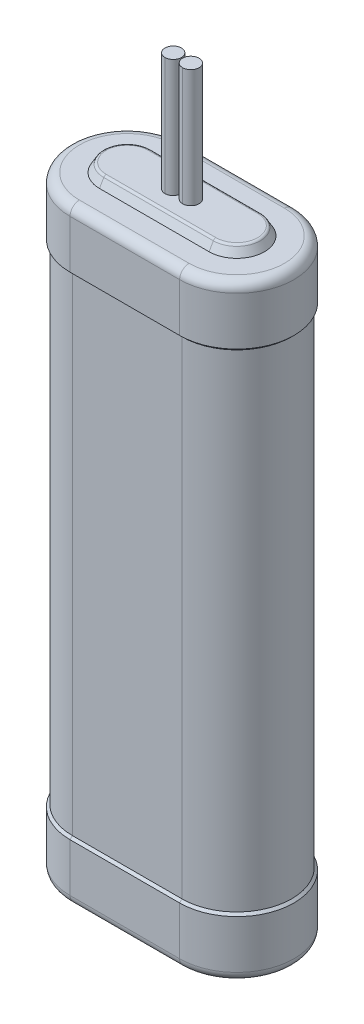
ISO-10303-21;
HEADER;
FILE_DESCRIPTION(('STEP AP214'),'2;1');
FILE_NAME('part.step','',(''),(''),'','','');
FILE_SCHEMA(('AUTOMOTIVE_DESIGN { 1 0 10303 214 1 1 1 1 }'));
ENDSEC;
DATA;
#1=APPLICATION_CONTEXT('core data for automotive mechanical design processes');
#2=APPLICATION_PROTOCOL_DEFINITION('international standard','automotive_design',2000,#1);
#3=PRODUCT_CONTEXT('',#1,'mechanical');
#4=PRODUCT('Part','Part','',(#3));
#5=PRODUCT_RELATED_PRODUCT_CATEGORY('part','',(#4));
#6=PRODUCT_DEFINITION_FORMATION('','',#4);
#7=PRODUCT_DEFINITION_CONTEXT('part definition',#1,'design');
#8=PRODUCT_DEFINITION('design','',#6,#7);
#9=PRODUCT_DEFINITION_SHAPE('','',#8);
#10=(LENGTH_UNIT() NAMED_UNIT(*) SI_UNIT(.MILLI.,.METRE.));
#11=(NAMED_UNIT(*) PLANE_ANGLE_UNIT() SI_UNIT($,.RADIAN.));
#12=(NAMED_UNIT(*) SI_UNIT($,.STERADIAN.) SOLID_ANGLE_UNIT());
#13=UNCERTAINTY_MEASURE_WITH_UNIT(LENGTH_MEASURE(1.E-05),#10,'distance_accuracy_value','');
#14=(GEOMETRIC_REPRESENTATION_CONTEXT(3) GLOBAL_UNCERTAINTY_ASSIGNED_CONTEXT((#13)) GLOBAL_UNIT_ASSIGNED_CONTEXT((#10,
#11,#12)) REPRESENTATION_CONTEXT('',''));
#15=CARTESIAN_POINT('',(0.,0.,0.));
#16=DIRECTION('',(0.,0.,1.));
#17=DIRECTION('',(1.,0.,0.));
#18=AXIS2_PLACEMENT_3D('',#15,#16,#17);
#19=CARTESIAN_POINT('',(11.811,52.451,11.811));
#20=DIRECTION('',(0.,0.707106781186548,-0.707106781186548));
#21=DIRECTION('',(-1.,0.,0.));
#22=AXIS2_PLACEMENT_3D('',#19,#20,#21);
#23=PLANE('',#22);
#24=DIRECTION('',(0.,0.707106781186548,0.707106781186548));
#25=VECTOR('',#24,1.);
#26=CARTESIAN_POINT('',(11.811,52.451,11.811));
#27=LINE('',#26,#25);
#28=CARTESIAN_POINT('',(11.811,52.451,11.811));
#29=VERTEX_POINT('',#28);
#30=CARTESIAN_POINT('',(11.811,52.959,12.319));
#31=VERTEX_POINT('',#30);
#32=EDGE_CURVE('E10',#29,#31,#27,.T.);
#33=ORIENTED_EDGE('',*,*,#32,.T.);
#34=DIRECTION('',(1.,0.,0.));
#35=VECTOR('',#34,1.);
#36=CARTESIAN_POINT('',(11.811,52.959,12.319));
#37=LINE('',#36,#35);
#38=CARTESIAN_POINT('',(-11.811,52.959,12.319));
#39=VERTEX_POINT('',#38);
#40=EDGE_CURVE('E328',#39,#31,#37,.T.);
#41=ORIENTED_EDGE('',*,*,#40,.F.);
#42=DIRECTION('',(0.,0.707106781186548,0.707106781186548));
#43=VECTOR('',#42,1.);
#44=CARTESIAN_POINT('',(-11.811,52.451,11.811));
#45=LINE('',#44,#43);
#46=CARTESIAN_POINT('',(-11.811,52.451,11.811));
#47=VERTEX_POINT('',#46);
#48=EDGE_CURVE('E343',#47,#39,#45,.T.);
#49=ORIENTED_EDGE('',*,*,#48,.F.);
#50=DIRECTION('',(1.,0.,0.));
#51=VECTOR('',#50,1.);
#52=CARTESIAN_POINT('',(-11.811,52.451,11.811));
#53=LINE('',#52,#51);
#54=EDGE_CURVE('E30',#47,#29,#53,.T.);
#55=ORIENTED_EDGE('',*,*,#54,.T.);
#56=EDGE_LOOP('',(#33,#41,#49,#55));
#57=FACE_BOUND('',#56,.T.);
#58=ADVANCED_FACE('F16',(#57),#23,.F.);
#59=CARTESIAN_POINT('',(11.811,52.451,0.));
#60=DIRECTION('',(0.,1.,0.));
#61=DIRECTION('',(0.,0.,1.));
#62=AXIS2_PLACEMENT_3D('',#59,#60,#61);
#63=CONICAL_SURFACE('',#62,11.811,0.785398163397448);
#64=DIRECTION('',(0.,-0.707106781186548,0.707106781186548));
#65=VECTOR('',#64,1.);
#66=CARTESIAN_POINT('',(11.811,52.959,-12.319));
#67=LINE('',#66,#65);
#68=CARTESIAN_POINT('',(11.811,52.959,-12.319));
#69=VERTEX_POINT('',#68);
#70=CARTESIAN_POINT('',(11.811,52.451,-11.811));
#71=VERTEX_POINT('',#70);
#72=EDGE_CURVE('E331',#69,#71,#67,.T.);
#73=ORIENTED_EDGE('',*,*,#72,.F.);
#74=CARTESIAN_POINT('',(11.811,52.959,0.));
#75=DIRECTION('',(0.,1.,0.));
#76=DIRECTION('',(0.,0.,1.));
#77=AXIS2_PLACEMENT_3D('',#74,#75,#76);
#78=CIRCLE('',#77,12.319);
#79=EDGE_CURVE('E45',#31,#69,#78,.T.);
#80=ORIENTED_EDGE('',*,*,#79,.F.);
#81=ORIENTED_EDGE('',*,*,#32,.F.);
#82=CARTESIAN_POINT('',(11.811,52.451,0.));
#83=DIRECTION('',(0.,1.,0.));
#84=DIRECTION('',(0.,0.,1.));
#85=AXIS2_PLACEMENT_3D('',#82,#83,#84);
#86=CIRCLE('',#85,11.811);
#87=EDGE_CURVE('E335',#29,#71,#86,.T.);
#88=ORIENTED_EDGE('',*,*,#87,.T.);
#89=EDGE_LOOP('',(#73,#80,#81,#88));
#90=FACE_BOUND('',#89,.T.);
#91=ADVANCED_FACE('F579',(#90),#63,.T.);
#92=CARTESIAN_POINT('',(11.811,52.451,12.319));
#93=DIRECTION('',(0.,0.,-1.));
#94=DIRECTION('',(0.,-1.,0.));
#95=AXIS2_PLACEMENT_3D('',#92,#93,#94);
#96=PLANE('',#95);
#97=DIRECTION('',(0.,1.,0.));
#98=VECTOR('',#97,1.);
#99=CARTESIAN_POINT('',(-11.811,52.451,12.319));
#100=LINE('',#99,#98);
#101=CARTESIAN_POINT('',(-11.811,63.373,12.319));
#102=VERTEX_POINT('',#101);
#103=EDGE_CURVE('E280',#39,#102,#100,.T.);
#104=ORIENTED_EDGE('',*,*,#103,.F.);
#105=ORIENTED_EDGE('',*,*,#40,.T.);
#106=DIRECTION('',(0.,1.,0.));
#107=VECTOR('',#106,1.);
#108=CARTESIAN_POINT('',(11.811,52.451,12.319));
#109=LINE('',#108,#107);
#110=CARTESIAN_POINT('',(11.811,63.373,12.319));
#111=VERTEX_POINT('',#110);
#112=EDGE_CURVE('E334',#31,#111,#109,.T.);
#113=ORIENTED_EDGE('',*,*,#112,.T.);
#114=DIRECTION('',(-1.,0.,0.));
#115=VECTOR('',#114,1.);
#116=CARTESIAN_POINT('',(-11.811,63.373,12.319));
#117=LINE('',#116,#115);
#118=EDGE_CURVE('E459',#111,#102,#117,.T.);
#119=ORIENTED_EDGE('',*,*,#118,.T.);
#120=EDGE_LOOP('',(#104,#105,#113,#119));
#121=FACE_BOUND('',#120,.T.);
#122=ADVANCED_FACE('F620',(#121),#96,.F.);
#123=CARTESIAN_POINT('',(-11.811,52.451,0.));
#124=DIRECTION('',(0.,1.,0.));
#125=DIRECTION('',(0.,0.,1.));
#126=AXIS2_PLACEMENT_3D('',#123,#124,#125);
#127=CONICAL_SURFACE('',#126,11.811,0.785398163397448);
#128=ORIENTED_EDGE('',*,*,#48,.T.);
#129=CARTESIAN_POINT('',(-11.811,52.959,0.));
#130=DIRECTION('',(0.,1.,0.));
#131=DIRECTION('',(0.,0.,1.));
#132=AXIS2_PLACEMENT_3D('',#129,#130,#131);
#133=CIRCLE('',#132,12.319);
#134=CARTESIAN_POINT('',(-11.811,52.959,-12.319));
#135=VERTEX_POINT('',#134);
#136=EDGE_CURVE('E322',#135,#39,#133,.T.);
#137=ORIENTED_EDGE('',*,*,#136,.F.);
#138=DIRECTION('',(0.,-0.707106781186548,0.707106781186548));
#139=VECTOR('',#138,1.);
#140=CARTESIAN_POINT('',(-11.811,52.959,-12.319));
#141=LINE('',#140,#139);
#142=CARTESIAN_POINT('',(-11.811,52.451,-11.811));
#143=VERTEX_POINT('',#142);
#144=EDGE_CURVE('E338',#135,#143,#141,.T.);
#145=ORIENTED_EDGE('',*,*,#144,.T.);
#146=CARTESIAN_POINT('',(-11.811,52.451,0.));
#147=DIRECTION('',(0.,1.,0.));
#148=DIRECTION('',(0.,0.,1.));
#149=AXIS2_PLACEMENT_3D('',#146,#147,#148);
#150=CIRCLE('',#149,11.811);
#151=EDGE_CURVE('E342',#143,#47,#150,.T.);
#152=ORIENTED_EDGE('',*,*,#151,.T.);
#153=EDGE_LOOP('',(#128,#137,#145,#152));
#154=FACE_BOUND('',#153,.T.);
#155=ADVANCED_FACE('F605',(#154),#127,.T.);
#156=CARTESIAN_POINT('',(-11.811,65.405,11.811));
#157=DIRECTION('',(0.,0.,-1.));
#158=DIRECTION('',(0.,-1.,0.));
#159=AXIS2_PLACEMENT_3D('',#156,#157,#158);
#160=PLANE('',#159);
#161=ORIENTED_EDGE('',*,*,#54,.F.);
#162=DIRECTION('',(0.,-1.,0.));
#163=VECTOR('',#162,1.);
#164=CARTESIAN_POINT('',(-11.811,65.405,11.811));
#165=LINE('',#164,#163);
#166=CARTESIAN_POINT('',(-11.811,-52.451,11.811));
#167=VERTEX_POINT('',#166);
#168=EDGE_CURVE('E391',#47,#167,#165,.T.);
#169=ORIENTED_EDGE('',*,*,#168,.T.);
#170=DIRECTION('',(-1.,0.,0.));
#171=VECTOR('',#170,1.);
#172=CARTESIAN_POINT('',(-11.811,-52.451,11.811));
#173=LINE('',#172,#171);
#174=CARTESIAN_POINT('',(11.811,-52.451,11.811));
#175=VERTEX_POINT('',#174);
#176=EDGE_CURVE('E294',#175,#167,#173,.T.);
#177=ORIENTED_EDGE('',*,*,#176,.F.);
#178=DIRECTION('',(0.,-1.,0.));
#179=VECTOR('',#178,1.);
#180=CARTESIAN_POINT('',(11.811,65.405,11.811));
#181=LINE('',#180,#179);
#182=EDGE_CURVE('E320',#29,#175,#181,.T.);
#183=ORIENTED_EDGE('',*,*,#182,.F.);
#184=EDGE_LOOP('',(#161,#169,#177,#183));
#185=FACE_BOUND('',#184,.T.);
#186=ADVANCED_FACE('F711',(#185),#160,.F.);
#187=CARTESIAN_POINT('',(11.811,52.451,0.));
#188=DIRECTION('',(0.,1.,0.));
#189=DIRECTION('',(0.,0.,1.));
#190=AXIS2_PLACEMENT_3D('',#187,#188,#189);
#191=CYLINDRICAL_SURFACE('',#190,12.319);
#192=ORIENTED_EDGE('',*,*,#112,.F.);
#193=ORIENTED_EDGE('',*,*,#79,.T.);
#194=DIRECTION('',(0.,1.,0.));
#195=VECTOR('',#194,1.);
#196=CARTESIAN_POINT('',(11.811,52.451,-12.319));
#197=LINE('',#196,#195);
#198=CARTESIAN_POINT('',(11.811,63.373,-12.319));
#199=VERTEX_POINT('',#198);
#200=EDGE_CURVE('E316',#69,#199,#197,.T.);
#201=ORIENTED_EDGE('',*,*,#200,.T.);
#202=CARTESIAN_POINT('',(11.811,63.373,0.));
#203=DIRECTION('',(0.,-1.,0.));
#204=DIRECTION('',(0.,0.,1.));
#205=AXIS2_PLACEMENT_3D('',#202,#203,#204);
#206=CIRCLE('',#205,12.319);
#207=EDGE_CURVE('E311',#199,#111,#206,.T.);
#208=ORIENTED_EDGE('',*,*,#207,.T.);
#209=EDGE_LOOP('',(#192,#193,#201,#208));
#210=FACE_BOUND('',#209,.T.);
#211=ADVANCED_FACE('F614',(#210),#191,.T.);
#212=CARTESIAN_POINT('',(11.811,65.405,0.));
#213=DIRECTION('',(0.,-1.,0.));
#214=DIRECTION('',(0.,0.,-1.));
#215=AXIS2_PLACEMENT_3D('',#212,#213,#214);
#216=CYLINDRICAL_SURFACE('',#215,11.811);
#217=ORIENTED_EDGE('',*,*,#87,.F.);
#218=ORIENTED_EDGE('',*,*,#182,.T.);
#219=CARTESIAN_POINT('',(11.811,-52.451,0.));
#220=DIRECTION('',(0.,-1.,0.));
#221=DIRECTION('',(0.,0.,-1.));
#222=AXIS2_PLACEMENT_3D('',#219,#220,#221);
#223=CIRCLE('',#222,11.811);
#224=CARTESIAN_POINT('',(11.811,-52.451,-11.811));
#225=VERTEX_POINT('',#224);
#226=EDGE_CURVE('E427',#225,#175,#223,.T.);
#227=ORIENTED_EDGE('',*,*,#226,.F.);
#228=DIRECTION('',(0.,-1.,0.));
#229=VECTOR('',#228,1.);
#230=CARTESIAN_POINT('',(11.811,65.405,-11.811));
#231=LINE('',#230,#229);
#232=EDGE_CURVE('E323',#71,#225,#231,.T.);
#233=ORIENTED_EDGE('',*,*,#232,.F.);
#234=EDGE_LOOP('',(#217,#218,#227,#233));
#235=FACE_BOUND('',#234,.T.);
#236=ADVANCED_FACE('F709',(#235),#216,.T.);
#237=CARTESIAN_POINT('',(11.811,52.451,-11.811));
#238=DIRECTION('',(0.,0.707106781186548,0.707106781186548));
#239=DIRECTION('',(1.,0.,0.));
#240=AXIS2_PLACEMENT_3D('',#237,#238,#239);
#241=PLANE('',#240);
#242=ORIENTED_EDGE('',*,*,#72,.T.);
#243=DIRECTION('',(-1.,0.,0.));
#244=VECTOR('',#243,1.);
#245=CARTESIAN_POINT('',(-11.811,52.451,-11.811));
#246=LINE('',#245,#244);
#247=EDGE_CURVE('E339',#71,#143,#246,.T.);
#248=ORIENTED_EDGE('',*,*,#247,.T.);
#249=ORIENTED_EDGE('',*,*,#144,.F.);
#250=DIRECTION('',(-1.,0.,0.));
#251=VECTOR('',#250,1.);
#252=CARTESIAN_POINT('',(-11.811,52.959,-12.319));
#253=LINE('',#252,#251);
#254=EDGE_CURVE('E390',#69,#135,#253,.T.);
#255=ORIENTED_EDGE('',*,*,#254,.F.);
#256=EDGE_LOOP('',(#242,#248,#249,#255));
#257=FACE_BOUND('',#256,.T.);
#258=ADVANCED_FACE('F591',(#257),#241,.F.);
#259=CARTESIAN_POINT('',(11.811,63.373,10.287));
#260=DIRECTION('',(1.,0.,0.));
#261=DIRECTION('',(0.,0.,-1.));
#262=AXIS2_PLACEMENT_3D('',#259,#260,#261);
#263=CYLINDRICAL_SURFACE('',#262,2.032);
#264=CARTESIAN_POINT('',(-11.811,63.373,10.287));
#265=DIRECTION('',(1.,0.,0.));
#266=DIRECTION('',(0.,0.,-1.));
#267=AXIS2_PLACEMENT_3D('',#264,#265,#266);
#268=CIRCLE('',#267,2.032);
#269=CARTESIAN_POINT('',(-11.811,65.405,10.287));
#270=VERTEX_POINT('',#269);
#271=EDGE_CURVE('E327',#270,#102,#268,.T.);
#272=ORIENTED_EDGE('',*,*,#271,.T.);
#273=ORIENTED_EDGE('',*,*,#118,.F.);
#274=CARTESIAN_POINT('',(11.811,63.373,10.287));
#275=DIRECTION('',(1.,0.,0.));
#276=DIRECTION('',(0.,0.,-1.));
#277=AXIS2_PLACEMENT_3D('',#274,#275,#276);
#278=CIRCLE('',#277,2.032);
#279=CARTESIAN_POINT('',(11.811,65.405,10.287));
#280=VERTEX_POINT('',#279);
#281=EDGE_CURVE('E347',#280,#111,#278,.T.);
#282=ORIENTED_EDGE('',*,*,#281,.F.);
#283=DIRECTION('',(1.,0.,0.));
#284=VECTOR('',#283,1.);
#285=CARTESIAN_POINT('',(11.811,65.405,10.287));
#286=LINE('',#285,#284);
#287=EDGE_CURVE('E349',#270,#280,#286,.T.);
#288=ORIENTED_EDGE('',*,*,#287,.F.);
#289=EDGE_LOOP('',(#272,#273,#282,#288));
#290=FACE_BOUND('',#289,.T.);
#291=ADVANCED_FACE('F623',(#290),#263,.T.);
#292=CARTESIAN_POINT('',(-11.811,52.451,0.));
#293=DIRECTION('',(0.,1.,0.));
#294=DIRECTION('',(0.,0.,1.));
#295=AXIS2_PLACEMENT_3D('',#292,#293,#294);
#296=CYLINDRICAL_SURFACE('',#295,12.319);
#297=DIRECTION('',(0.,1.,0.));
#298=VECTOR('',#297,1.);
#299=CARTESIAN_POINT('',(-11.811,52.451,-12.319));
#300=LINE('',#299,#298);
#301=CARTESIAN_POINT('',(-11.811,63.373,-12.319));
#302=VERTEX_POINT('',#301);
#303=EDGE_CURVE('E325',#135,#302,#300,.T.);
#304=ORIENTED_EDGE('',*,*,#303,.F.);
#305=ORIENTED_EDGE('',*,*,#136,.T.);
#306=ORIENTED_EDGE('',*,*,#103,.T.);
#307=CARTESIAN_POINT('',(-11.811,63.373,0.));
#308=DIRECTION('',(0.,-1.,0.));
#309=DIRECTION('',(0.,0.,1.));
#310=AXIS2_PLACEMENT_3D('',#307,#308,#309);
#311=CIRCLE('',#310,12.319);
#312=EDGE_CURVE('E273',#102,#302,#311,.T.);
#313=ORIENTED_EDGE('',*,*,#312,.T.);
#314=EDGE_LOOP('',(#304,#305,#306,#313));
#315=FACE_BOUND('',#314,.T.);
#316=ADVANCED_FACE('F607',(#315),#296,.T.);
#317=CARTESIAN_POINT('',(-11.811,65.405,0.));
#318=DIRECTION('',(0.,-1.,0.));
#319=DIRECTION('',(0.,0.,-1.));
#320=AXIS2_PLACEMENT_3D('',#317,#318,#319);
#321=CYLINDRICAL_SURFACE('',#320,11.811);
#322=ORIENTED_EDGE('',*,*,#151,.F.);
#323=DIRECTION('',(0.,-1.,0.));
#324=VECTOR('',#323,1.);
#325=CARTESIAN_POINT('',(-11.811,65.405,-11.811));
#326=LINE('',#325,#324);
#327=CARTESIAN_POINT('',(-11.811,-52.451,-11.811));
#328=VERTEX_POINT('',#327);
#329=EDGE_CURVE('E279',#143,#328,#326,.T.);
#330=ORIENTED_EDGE('',*,*,#329,.T.);
#331=CARTESIAN_POINT('',(-11.811,-52.451,0.));
#332=DIRECTION('',(0.,-1.,0.));
#333=DIRECTION('',(0.,0.,-1.));
#334=AXIS2_PLACEMENT_3D('',#331,#332,#333);
#335=CIRCLE('',#334,11.811);
#336=EDGE_CURVE('E305',#167,#328,#335,.T.);
#337=ORIENTED_EDGE('',*,*,#336,.F.);
#338=ORIENTED_EDGE('',*,*,#168,.F.);
#339=EDGE_LOOP('',(#322,#330,#337,#338));
#340=FACE_BOUND('',#339,.T.);
#341=ADVANCED_FACE('F598',(#340),#321,.T.);
#342=CARTESIAN_POINT('',(11.811,-52.959,12.319));
#343=DIRECTION('',(0.,0.707106781186548,0.707106781186548));
#344=DIRECTION('',(1.,0.,0.));
#345=AXIS2_PLACEMENT_3D('',#342,#343,#344);
#346=PLANE('',#345);
#347=DIRECTION('',(0.,-0.707106781186548,0.707106781186548));
#348=VECTOR('',#347,1.);
#349=CARTESIAN_POINT('',(-11.811,-52.451,11.811));
#350=LINE('',#349,#348);
#351=CARTESIAN_POINT('',(-11.811,-52.959,12.319));
#352=VERTEX_POINT('',#351);
#353=EDGE_CURVE('E295',#167,#352,#350,.T.);
#354=ORIENTED_EDGE('',*,*,#353,.T.);
#355=DIRECTION('',(-1.,0.,0.));
#356=VECTOR('',#355,1.);
#357=CARTESIAN_POINT('',(-11.811,-52.959,12.319));
#358=LINE('',#357,#356);
#359=CARTESIAN_POINT('',(11.811,-52.959,12.319));
#360=VERTEX_POINT('',#359);
#361=EDGE_CURVE('E297',#360,#352,#358,.T.);
#362=ORIENTED_EDGE('',*,*,#361,.F.);
#363=DIRECTION('',(0.,-0.707106781186548,0.707106781186548));
#364=VECTOR('',#363,1.);
#365=CARTESIAN_POINT('',(11.811,-52.451,11.811));
#366=LINE('',#365,#364);
#367=EDGE_CURVE('E352',#175,#360,#366,.T.);
#368=ORIENTED_EDGE('',*,*,#367,.F.);
#369=ORIENTED_EDGE('',*,*,#176,.T.);
#370=EDGE_LOOP('',(#354,#362,#368,#369));
#371=FACE_BOUND('',#370,.T.);
#372=ADVANCED_FACE('F691',(#371),#346,.T.);
#373=CARTESIAN_POINT('',(11.811,63.373,0.));
#374=DIRECTION('',(0.,1.,0.));
#375=DIRECTION('',(0.,0.,1.));
#376=AXIS2_PLACEMENT_3D('',#373,#374,#375);
#377=TOROIDAL_SURFACE('',#376,10.287,2.032);
#378=CARTESIAN_POINT('',(11.811,63.373,-10.287));
#379=DIRECTION('',(1.,0.,0.));
#380=DIRECTION('',(0.,0.,-1.));
#381=AXIS2_PLACEMENT_3D('',#378,#379,#380);
#382=CIRCLE('',#381,2.032);
#383=CARTESIAN_POINT('',(11.811,65.405,-10.287));
#384=VERTEX_POINT('',#383);
#385=EDGE_CURVE('E344',#199,#384,#382,.T.);
#386=ORIENTED_EDGE('',*,*,#385,.T.);
#387=CARTESIAN_POINT('',(11.811,65.405,0.));
#388=DIRECTION('',(0.,1.,0.));
#389=DIRECTION('',(0.,0.,1.));
#390=AXIS2_PLACEMENT_3D('',#387,#388,#389);
#391=CIRCLE('',#390,10.287);
#392=EDGE_CURVE('E353',#280,#384,#391,.T.);
#393=ORIENTED_EDGE('',*,*,#392,.F.);
#394=ORIENTED_EDGE('',*,*,#281,.T.);
#395=ORIENTED_EDGE('',*,*,#207,.F.);
#396=EDGE_LOOP('',(#386,#393,#394,#395));
#397=FACE_BOUND('',#396,.T.);
#398=ADVANCED_FACE('F625',(#397),#377,.T.);
#399=CARTESIAN_POINT('',(-11.811,52.451,-12.319));
#400=DIRECTION('',(0.,0.,1.));
#401=DIRECTION('',(1.,0.,0.));
#402=AXIS2_PLACEMENT_3D('',#399,#400,#401);
#403=PLANE('',#402);
#404=ORIENTED_EDGE('',*,*,#200,.F.);
#405=ORIENTED_EDGE('',*,*,#254,.T.);
#406=ORIENTED_EDGE('',*,*,#303,.T.);
#407=DIRECTION('',(1.,0.,0.));
#408=VECTOR('',#407,1.);
#409=CARTESIAN_POINT('',(11.811,63.373,-12.319));
#410=LINE('',#409,#408);
#411=EDGE_CURVE('E318',#302,#199,#410,.T.);
#412=ORIENTED_EDGE('',*,*,#411,.T.);
#413=EDGE_LOOP('',(#404,#405,#406,#412));
#414=FACE_BOUND('',#413,.T.);
#415=ADVANCED_FACE('F608',(#414),#403,.F.);
#416=CARTESIAN_POINT('',(-11.811,65.405,-11.811));
#417=DIRECTION('',(0.,0.,1.));
#418=DIRECTION('',(1.,0.,0.));
#419=AXIS2_PLACEMENT_3D('',#416,#417,#418);
#420=PLANE('',#419);
#421=ORIENTED_EDGE('',*,*,#247,.F.);
#422=ORIENTED_EDGE('',*,*,#232,.T.);
#423=DIRECTION('',(1.,0.,0.));
#424=VECTOR('',#423,1.);
#425=CARTESIAN_POINT('',(-11.811,-52.451,-11.811));
#426=LINE('',#425,#424);
#427=EDGE_CURVE('E275',#328,#225,#426,.T.);
#428=ORIENTED_EDGE('',*,*,#427,.F.);
#429=ORIENTED_EDGE('',*,*,#329,.F.);
#430=EDGE_LOOP('',(#421,#422,#428,#429));
#431=FACE_BOUND('',#430,.T.);
#432=ADVANCED_FACE('F590',(#431),#420,.F.);
#433=CARTESIAN_POINT('',(11.811,-52.959,0.));
#434=DIRECTION('',(0.,-1.,0.));
#435=DIRECTION('',(0.,0.,-1.));
#436=AXIS2_PLACEMENT_3D('',#433,#434,#435);
#437=CONICAL_SURFACE('',#436,12.319,0.785398163397448);
#438=DIRECTION('',(0.,0.707106781186548,0.707106781186548));
#439=VECTOR('',#438,1.);
#440=CARTESIAN_POINT('',(11.811,-52.959,-12.319));
#441=LINE('',#440,#439);
#442=CARTESIAN_POINT('',(11.811,-52.959,-12.319));
#443=VERTEX_POINT('',#442);
#444=EDGE_CURVE('E477',#443,#225,#441,.T.);
#445=ORIENTED_EDGE('',*,*,#444,.T.);
#446=ORIENTED_EDGE('',*,*,#226,.T.);
#447=ORIENTED_EDGE('',*,*,#367,.T.);
#448=CARTESIAN_POINT('',(11.811,-52.959,0.));
#449=DIRECTION('',(0.,-1.,0.));
#450=DIRECTION('',(0.,0.,-1.));
#451=AXIS2_PLACEMENT_3D('',#448,#449,#450);
#452=CIRCLE('',#451,12.319);
#453=EDGE_CURVE('E450',#443,#360,#452,.T.);
#454=ORIENTED_EDGE('',*,*,#453,.F.);
#455=EDGE_LOOP('',(#445,#446,#447,#454));
#456=FACE_BOUND('',#455,.T.);
#457=ADVANCED_FACE('F687',(#456),#437,.T.);
#458=CARTESIAN_POINT('',(-11.811,65.405,0.));
#459=DIRECTION('',(0.,1.,0.));
#460=DIRECTION('',(1.,0.,0.));
#461=AXIS2_PLACEMENT_3D('',#458,#459,#460);
#462=PLANE('',#461);
#463=ORIENTED_EDGE('',*,*,#287,.T.);
#464=ORIENTED_EDGE('',*,*,#392,.T.);
#465=DIRECTION('',(-1.,0.,0.));
#466=VECTOR('',#465,1.);
#467=CARTESIAN_POINT('',(-11.811,65.405,-10.287));
#468=LINE('',#467,#466);
#469=CARTESIAN_POINT('',(-11.811,65.405,-10.287));
#470=VERTEX_POINT('',#469);
#471=EDGE_CURVE('E306',#384,#470,#468,.T.);
#472=ORIENTED_EDGE('',*,*,#471,.T.);
#473=CARTESIAN_POINT('',(-11.811,65.405,0.));
#474=DIRECTION('',(0.,1.,0.));
#475=DIRECTION('',(0.,0.,1.));
#476=AXIS2_PLACEMENT_3D('',#473,#474,#475);
#477=CIRCLE('',#476,10.287);
#478=EDGE_CURVE('E302',#470,#270,#477,.T.);
#479=ORIENTED_EDGE('',*,*,#478,.T.);
#480=EDGE_LOOP('',(#463,#464,#472,#479));
#481=FACE_BOUND('',#480,.T.);
#482=DIRECTION('',(-1.,0.,0.));
#483=VECTOR('',#482,1.);
#484=CARTESIAN_POINT('',(11.811,65.405,-5.969));
#485=LINE('',#484,#483);
#486=CARTESIAN_POINT('',(11.811,65.405,-5.969));
#487=VERTEX_POINT('',#486);
#488=CARTESIAN_POINT('',(-11.811,65.405,-5.969));
#489=VERTEX_POINT('',#488);
#490=EDGE_CURVE('E245',#487,#489,#485,.T.);
#491=ORIENTED_EDGE('',*,*,#490,.F.);
#492=CARTESIAN_POINT('',(11.811,65.405,0.));
#493=DIRECTION('',(0.,1.,0.));
#494=DIRECTION('',(0.,0.,1.));
#495=AXIS2_PLACEMENT_3D('',#492,#493,#494);
#496=CIRCLE('',#495,5.969);
#497=CARTESIAN_POINT('',(11.811,65.405,5.969));
#498=VERTEX_POINT('',#497);
#499=EDGE_CURVE('E252',#498,#487,#496,.T.);
#500=ORIENTED_EDGE('',*,*,#499,.F.);
#501=DIRECTION('',(1.,0.,0.));
#502=VECTOR('',#501,1.);
#503=CARTESIAN_POINT('',(-11.811,65.405,5.969));
#504=LINE('',#503,#502);
#505=CARTESIAN_POINT('',(-11.811,65.405,5.969));
#506=VERTEX_POINT('',#505);
#507=EDGE_CURVE('E236',#506,#498,#504,.T.);
#508=ORIENTED_EDGE('',*,*,#507,.F.);
#509=CARTESIAN_POINT('',(-11.811,65.405,0.));
#510=DIRECTION('',(0.,1.,0.));
#511=DIRECTION('',(0.,0.,1.));
#512=AXIS2_PLACEMENT_3D('',#509,#510,#511);
#513=CIRCLE('',#512,5.969);
#514=EDGE_CURVE('E287',#489,#506,#513,.T.);
#515=ORIENTED_EDGE('',*,*,#514,.F.);
#516=EDGE_LOOP('',(#491,#500,#508,#515));
#517=FACE_BOUND('',#516,.T.);
#518=ADVANCED_FACE('F631',(#481,#517),#462,.T.);
#519=CARTESIAN_POINT('',(-11.811,63.373,0.));
#520=DIRECTION('',(0.,1.,0.));
#521=DIRECTION('',(0.,0.,1.));
#522=AXIS2_PLACEMENT_3D('',#519,#520,#521);
#523=TOROIDAL_SURFACE('',#522,10.287,2.032);
#524=ORIENTED_EDGE('',*,*,#271,.F.);
#525=ORIENTED_EDGE('',*,*,#478,.F.);
#526=CARTESIAN_POINT('',(-11.811,63.373,-10.287));
#527=DIRECTION('',(1.,0.,0.));
#528=DIRECTION('',(0.,0.,-1.));
#529=AXIS2_PLACEMENT_3D('',#526,#527,#528);
#530=CIRCLE('',#529,2.032);
#531=EDGE_CURVE('E276',#302,#470,#530,.T.);
#532=ORIENTED_EDGE('',*,*,#531,.F.);
#533=ORIENTED_EDGE('',*,*,#312,.F.);
#534=EDGE_LOOP('',(#524,#525,#532,#533));
#535=FACE_BOUND('',#534,.T.);
#536=ADVANCED_FACE('F628',(#535),#523,.T.);
#537=CARTESIAN_POINT('',(-11.811,-52.959,0.));
#538=DIRECTION('',(0.,-1.,0.));
#539=DIRECTION('',(0.,0.,-1.));
#540=AXIS2_PLACEMENT_3D('',#537,#538,#539);
#541=CONICAL_SURFACE('',#540,12.319,0.785398163397448);
#542=ORIENTED_EDGE('',*,*,#353,.F.);
#543=ORIENTED_EDGE('',*,*,#336,.T.);
#544=DIRECTION('',(0.,0.707106781186548,0.707106781186548));
#545=VECTOR('',#544,1.);
#546=CARTESIAN_POINT('',(-11.811,-52.959,-12.319));
#547=LINE('',#546,#545);
#548=CARTESIAN_POINT('',(-11.811,-52.959,-12.319));
#549=VERTEX_POINT('',#548);
#550=EDGE_CURVE('E283',#549,#328,#547,.T.);
#551=ORIENTED_EDGE('',*,*,#550,.F.);
#552=CARTESIAN_POINT('',(-11.811,-52.959,0.));
#553=DIRECTION('',(0.,-1.,0.));
#554=DIRECTION('',(0.,0.,-1.));
#555=AXIS2_PLACEMENT_3D('',#552,#553,#554);
#556=CIRCLE('',#555,12.319);
#557=EDGE_CURVE('E516',#352,#549,#556,.T.);
#558=ORIENTED_EDGE('',*,*,#557,.F.);
#559=EDGE_LOOP('',(#542,#543,#551,#558));
#560=FACE_BOUND('',#559,.T.);
#561=ADVANCED_FACE('F649',(#560),#541,.T.);
#562=CARTESIAN_POINT('',(11.811,-52.451,12.319));
#563=DIRECTION('',(0.,0.,1.));
#564=DIRECTION('',(1.,0.,0.));
#565=AXIS2_PLACEMENT_3D('',#562,#563,#564);
#566=PLANE('',#565);
#567=DIRECTION('',(0.,-1.,0.));
#568=VECTOR('',#567,1.);
#569=CARTESIAN_POINT('',(11.811,-52.451,12.319));
#570=LINE('',#569,#568);
#571=CARTESIAN_POINT('',(11.811,-63.373,12.319));
#572=VERTEX_POINT('',#571);
#573=EDGE_CURVE('E419',#360,#572,#570,.T.);
#574=ORIENTED_EDGE('',*,*,#573,.F.);
#575=ORIENTED_EDGE('',*,*,#361,.T.);
#576=DIRECTION('',(0.,-1.,0.));
#577=VECTOR('',#576,1.);
#578=CARTESIAN_POINT('',(-11.811,-52.451,12.319));
#579=LINE('',#578,#577);
#580=CARTESIAN_POINT('',(-11.811,-63.373,12.319));
#581=VERTEX_POINT('',#580);
#582=EDGE_CURVE('E303',#352,#581,#579,.T.);
#583=ORIENTED_EDGE('',*,*,#582,.T.);
#584=DIRECTION('',(1.,0.,0.));
#585=VECTOR('',#584,1.);
#586=CARTESIAN_POINT('',(11.811,-63.373,12.319));
#587=LINE('',#586,#585);
#588=EDGE_CURVE('E284',#581,#572,#587,.T.);
#589=ORIENTED_EDGE('',*,*,#588,.T.);
#590=EDGE_LOOP('',(#574,#575,#583,#589));
#591=FACE_BOUND('',#590,.T.);
#592=ADVANCED_FACE('F639',(#591),#566,.T.);
#593=CARTESIAN_POINT('',(-11.811,63.373,-10.287));
#594=DIRECTION('',(-1.,0.,0.));
#595=DIRECTION('',(0.,0.,1.));
#596=AXIS2_PLACEMENT_3D('',#593,#594,#595);
#597=CYLINDRICAL_SURFACE('',#596,2.032);
#598=ORIENTED_EDGE('',*,*,#531,.T.);
#599=ORIENTED_EDGE('',*,*,#471,.F.);
#600=ORIENTED_EDGE('',*,*,#385,.F.);
#601=ORIENTED_EDGE('',*,*,#411,.F.);
#602=EDGE_LOOP('',(#598,#599,#600,#601));
#603=FACE_BOUND('',#602,.T.);
#604=ADVANCED_FACE('F637',(#603),#597,.T.);
#605=CARTESIAN_POINT('',(-11.811,-52.959,-12.319));
#606=DIRECTION('',(0.,0.707106781186548,-0.707106781186548));
#607=DIRECTION('',(-1.,0.,0.));
#608=AXIS2_PLACEMENT_3D('',#605,#606,#607);
#609=PLANE('',#608);
#610=ORIENTED_EDGE('',*,*,#550,.T.);
#611=ORIENTED_EDGE('',*,*,#427,.T.);
#612=ORIENTED_EDGE('',*,*,#444,.F.);
#613=DIRECTION('',(1.,0.,0.));
#614=VECTOR('',#613,1.);
#615=CARTESIAN_POINT('',(11.811,-52.959,-12.319));
#616=LINE('',#615,#614);
#617=EDGE_CURVE('E456',#549,#443,#616,.T.);
#618=ORIENTED_EDGE('',*,*,#617,.F.);
#619=EDGE_LOOP('',(#610,#611,#612,#618));
#620=FACE_BOUND('',#619,.T.);
#621=ADVANCED_FACE('F640',(#620),#609,.T.);
#622=CARTESIAN_POINT('',(11.811,-52.451,0.));
#623=DIRECTION('',(0.,-1.,0.));
#624=DIRECTION('',(0.,0.,-1.));
#625=AXIS2_PLACEMENT_3D('',#622,#623,#624);
#626=CYLINDRICAL_SURFACE('',#625,12.319);
#627=DIRECTION('',(0.,-1.,0.));
#628=VECTOR('',#627,1.);
#629=CARTESIAN_POINT('',(11.811,-52.451,-12.319));
#630=LINE('',#629,#628);
#631=CARTESIAN_POINT('',(11.811,-63.373,-12.319));
#632=VERTEX_POINT('',#631);
#633=EDGE_CURVE('E453',#443,#632,#630,.T.);
#634=ORIENTED_EDGE('',*,*,#633,.F.);
#635=ORIENTED_EDGE('',*,*,#453,.T.);
#636=ORIENTED_EDGE('',*,*,#573,.T.);
#637=CARTESIAN_POINT('',(11.811,-63.373,0.));
#638=DIRECTION('',(0.,1.,0.));
#639=DIRECTION('',(0.,0.,1.));
#640=AXIS2_PLACEMENT_3D('',#637,#638,#639);
#641=CIRCLE('',#640,12.319);
#642=EDGE_CURVE('E418',#572,#632,#641,.T.);
#643=ORIENTED_EDGE('',*,*,#642,.T.);
#644=EDGE_LOOP('',(#634,#635,#636,#643));
#645=FACE_BOUND('',#644,.T.);
#646=ADVANCED_FACE('F650',(#645),#626,.T.);
#647=CARTESIAN_POINT('',(-11.811,67.31,0.));
#648=DIRECTION('',(0.,-1.,0.));
#649=DIRECTION('',(0.,0.,-1.));
#650=AXIS2_PLACEMENT_3D('',#647,#648,#649);
#651=CONICAL_SURFACE('',#650,4.86914773719385,0.523598775598291);
#652=DIRECTION('',(0.,-0.866025403784443,0.499999999999993));
#653=VECTOR('',#652,1.);
#654=CARTESIAN_POINT('',(-11.811,67.31,4.86914773719385));
#655=LINE('',#654,#653);
#656=CARTESIAN_POINT('',(-11.811,66.9925,5.05245644766155));
#657=VERTEX_POINT('',#656);
#658=EDGE_CURVE('E235',#657,#506,#655,.T.);
#659=ORIENTED_EDGE('',*,*,#658,.F.);
#660=CARTESIAN_POINT('',(-11.811,66.9925,0.));
#661=DIRECTION('',(0.,-1.,0.));
#662=DIRECTION('',(0.,0.,1.));
#663=AXIS2_PLACEMENT_3D('',#660,#661,#662);
#664=CIRCLE('',#663,5.05245644766155);
#665=CARTESIAN_POINT('',(-11.811,66.9925,-5.05245644766155));
#666=VERTEX_POINT('',#665);
#667=EDGE_CURVE('E288',#657,#666,#664,.T.);
#668=ORIENTED_EDGE('',*,*,#667,.T.);
#669=DIRECTION('',(0.,-0.866025403784443,-0.499999999999993));
#670=VECTOR('',#669,1.);
#671=CARTESIAN_POINT('',(-11.811,67.31,-4.86914773719385));
#672=LINE('',#671,#670);
#673=EDGE_CURVE('E285',#666,#489,#672,.T.);
#674=ORIENTED_EDGE('',*,*,#673,.T.);
#675=ORIENTED_EDGE('',*,*,#514,.T.);
#676=EDGE_LOOP('',(#659,#668,#674,#675));
#677=FACE_BOUND('',#676,.T.);
#678=ADVANCED_FACE('F684',(#677),#651,.T.);
#679=CARTESIAN_POINT('',(11.811,67.31,0.));
#680=DIRECTION('',(0.,-1.,0.));
#681=DIRECTION('',(0.,0.,-1.));
#682=AXIS2_PLACEMENT_3D('',#679,#680,#681);
#683=CONICAL_SURFACE('',#682,4.86914773719385,0.523598775598291);
#684=DIRECTION('',(0.,0.866025403784443,0.499999999999993));
#685=VECTOR('',#684,1.);
#686=CARTESIAN_POINT('',(11.811,65.405,-5.969));
#687=LINE('',#686,#685);
#688=CARTESIAN_POINT('',(11.811,66.9925,-5.05245644766155));
#689=VERTEX_POINT('',#688);
#690=EDGE_CURVE('E250',#487,#689,#687,.T.);
#691=ORIENTED_EDGE('',*,*,#690,.T.);
#692=CARTESIAN_POINT('',(11.811,66.9925,0.));
#693=DIRECTION('',(0.,-1.,0.));
#694=DIRECTION('',(0.,0.,1.));
#695=AXIS2_PLACEMENT_3D('',#692,#693,#694);
#696=CIRCLE('',#695,5.05245644766156);
#697=CARTESIAN_POINT('',(11.811,66.9925,5.05245644766155));
#698=VERTEX_POINT('',#697);
#699=EDGE_CURVE('E244',#689,#698,#696,.T.);
#700=ORIENTED_EDGE('',*,*,#699,.T.);
#701=DIRECTION('',(0.,0.866025403784443,-0.499999999999993));
#702=VECTOR('',#701,1.);
#703=CARTESIAN_POINT('',(11.811,65.405,5.969));
#704=LINE('',#703,#702);
#705=EDGE_CURVE('E231',#498,#698,#704,.T.);
#706=ORIENTED_EDGE('',*,*,#705,.F.);
#707=ORIENTED_EDGE('',*,*,#499,.T.);
#708=EDGE_LOOP('',(#691,#700,#706,#707));
#709=FACE_BOUND('',#708,.T.);
#710=ADVANCED_FACE('F246',(#709),#683,.T.);
#711=CARTESIAN_POINT('',(11.811,67.31,-4.86914773719385));
#712=DIRECTION('',(0.,0.499999999999993,-0.866025403784443));
#713=DIRECTION('',(-1.,0.,0.));
#714=AXIS2_PLACEMENT_3D('',#711,#712,#713);
#715=PLANE('',#714);
#716=ORIENTED_EDGE('',*,*,#673,.F.);
#717=DIRECTION('',(1.,0.,0.));
#718=VECTOR('',#717,1.);
#719=CARTESIAN_POINT('',(11.811,66.9925,-5.05245644766155));
#720=LINE('',#719,#718);
#721=EDGE_CURVE('E208',#666,#689,#720,.T.);
#722=ORIENTED_EDGE('',*,*,#721,.T.);
#723=ORIENTED_EDGE('',*,*,#690,.F.);
#724=ORIENTED_EDGE('',*,*,#490,.T.);
#725=EDGE_LOOP('',(#716,#722,#723,#724));
#726=FACE_BOUND('',#725,.T.);
#727=ADVANCED_FACE('F703',(#726),#715,.T.);
#728=CARTESIAN_POINT('',(11.811,67.31,4.86914773719385));
#729=DIRECTION('',(0.,0.499999999999993,0.866025403784443));
#730=DIRECTION('',(1.,0.,0.));
#731=AXIS2_PLACEMENT_3D('',#728,#729,#730);
#732=PLANE('',#731);
#733=ORIENTED_EDGE('',*,*,#705,.T.);
#734=DIRECTION('',(-1.,0.,0.));
#735=VECTOR('',#734,1.);
#736=CARTESIAN_POINT('',(11.811,66.9925,5.05245644766155));
#737=LINE('',#736,#735);
#738=EDGE_CURVE('E217',#698,#657,#737,.T.);
#739=ORIENTED_EDGE('',*,*,#738,.T.);
#740=ORIENTED_EDGE('',*,*,#658,.T.);
#741=ORIENTED_EDGE('',*,*,#507,.T.);
#742=EDGE_LOOP('',(#733,#739,#740,#741));
#743=FACE_BOUND('',#742,.T.);
#744=ADVANCED_FACE('F240',(#743),#732,.T.);
#745=CARTESIAN_POINT('',(-11.811,-52.451,0.));
#746=DIRECTION('',(0.,-1.,0.));
#747=DIRECTION('',(0.,0.,-1.));
#748=AXIS2_PLACEMENT_3D('',#745,#746,#747);
#749=CYLINDRICAL_SURFACE('',#748,12.319);
#750=ORIENTED_EDGE('',*,*,#582,.F.);
#751=ORIENTED_EDGE('',*,*,#557,.T.);
#752=DIRECTION('',(0.,-1.,0.));
#753=VECTOR('',#752,1.);
#754=CARTESIAN_POINT('',(-11.811,-52.451,-12.319));
#755=LINE('',#754,#753);
#756=CARTESIAN_POINT('',(-11.811,-63.373,-12.319));
#757=VERTEX_POINT('',#756);
#758=EDGE_CURVE('E505',#549,#757,#755,.T.);
#759=ORIENTED_EDGE('',*,*,#758,.T.);
#760=CARTESIAN_POINT('',(-11.811,-63.373,0.));
#761=DIRECTION('',(0.,1.,0.));
#762=DIRECTION('',(0.,0.,1.));
#763=AXIS2_PLACEMENT_3D('',#760,#761,#762);
#764=CIRCLE('',#763,12.319);
#765=EDGE_CURVE('E412',#757,#581,#764,.T.);
#766=ORIENTED_EDGE('',*,*,#765,.T.);
#767=EDGE_LOOP('',(#750,#751,#759,#766));
#768=FACE_BOUND('',#767,.T.);
#769=ADVANCED_FACE('F964',(#768),#749,.T.);
#770=CARTESIAN_POINT('',(-11.811,-63.373,10.287));
#771=DIRECTION('',(1.,0.,0.));
#772=DIRECTION('',(0.,0.,-1.));
#773=AXIS2_PLACEMENT_3D('',#770,#771,#772);
#774=CYLINDRICAL_SURFACE('',#773,2.032);
#775=CARTESIAN_POINT('',(11.811,-63.373,10.287));
#776=DIRECTION('',(-1.,0.,0.));
#777=DIRECTION('',(0.,0.,1.));
#778=AXIS2_PLACEMENT_3D('',#775,#776,#777);
#779=CIRCLE('',#778,2.032);
#780=CARTESIAN_POINT('',(11.811,-65.405,10.287));
#781=VERTEX_POINT('',#780);
#782=EDGE_CURVE('E409',#781,#572,#779,.T.);
#783=ORIENTED_EDGE('',*,*,#782,.T.);
#784=ORIENTED_EDGE('',*,*,#588,.F.);
#785=CARTESIAN_POINT('',(-11.811,-63.373,10.287));
#786=DIRECTION('',(1.,0.,0.));
#787=DIRECTION('',(0.,0.,-1.));
#788=AXIS2_PLACEMENT_3D('',#785,#786,#787);
#789=CIRCLE('',#788,2.032);
#790=CARTESIAN_POINT('',(-11.811,-65.405,10.287));
#791=VERTEX_POINT('',#790);
#792=EDGE_CURVE('E414',#581,#791,#789,.T.);
#793=ORIENTED_EDGE('',*,*,#792,.T.);
#794=DIRECTION('',(-1.,0.,0.));
#795=VECTOR('',#794,1.);
#796=CARTESIAN_POINT('',(-11.811,-65.405,10.287));
#797=LINE('',#796,#795);
#798=EDGE_CURVE('E356',#781,#791,#797,.T.);
#799=ORIENTED_EDGE('',*,*,#798,.F.);
#800=EDGE_LOOP('',(#783,#784,#793,#799));
#801=FACE_BOUND('',#800,.T.);
#802=ADVANCED_FACE('F1311',(#801),#774,.T.);
#803=CARTESIAN_POINT('',(-11.811,-52.451,-12.319));
#804=DIRECTION('',(0.,0.,-1.));
#805=DIRECTION('',(-1.,0.,0.));
#806=AXIS2_PLACEMENT_3D('',#803,#804,#805);
#807=PLANE('',#806);
#808=ORIENTED_EDGE('',*,*,#758,.F.);
#809=ORIENTED_EDGE('',*,*,#617,.T.);
#810=ORIENTED_EDGE('',*,*,#633,.T.);
#811=DIRECTION('',(-1.,0.,0.));
#812=VECTOR('',#811,1.);
#813=CARTESIAN_POINT('',(-11.811,-63.373,-12.319));
#814=LINE('',#813,#812);
#815=EDGE_CURVE('E422',#632,#757,#814,.T.);
#816=ORIENTED_EDGE('',*,*,#815,.T.);
#817=EDGE_LOOP('',(#808,#809,#810,#816));
#818=FACE_BOUND('',#817,.T.);
#819=ADVANCED_FACE('F661',(#818),#807,.T.);
#820=CARTESIAN_POINT('',(11.811,-63.373,0.));
#821=DIRECTION('',(0.,1.,0.));
#822=DIRECTION('',(0.,0.,1.));
#823=AXIS2_PLACEMENT_3D('',#820,#821,#822);
#824=TOROIDAL_SURFACE('',#823,10.287,2.032);
#825=CARTESIAN_POINT('',(11.811,-63.373,-10.287));
#826=DIRECTION('',(1.,0.,0.));
#827=DIRECTION('',(0.,0.,-1.));
#828=AXIS2_PLACEMENT_3D('',#825,#826,#827);
#829=CIRCLE('',#828,2.032);
#830=CARTESIAN_POINT('',(11.811,-65.405,-10.287));
#831=VERTEX_POINT('',#830);
#832=EDGE_CURVE('E423',#831,#632,#829,.T.);
#833=ORIENTED_EDGE('',*,*,#832,.T.);
#834=ORIENTED_EDGE('',*,*,#642,.F.);
#835=ORIENTED_EDGE('',*,*,#782,.F.);
#836=CARTESIAN_POINT('',(11.811,-65.405,0.));
#837=DIRECTION('',(0.,-1.,0.));
#838=DIRECTION('',(0.,0.,1.));
#839=AXIS2_PLACEMENT_3D('',#836,#837,#838);
#840=CIRCLE('',#839,10.287);
#841=EDGE_CURVE('E268',#831,#781,#840,.T.);
#842=ORIENTED_EDGE('',*,*,#841,.F.);
#843=EDGE_LOOP('',(#833,#834,#835,#842));
#844=FACE_BOUND('',#843,.T.);
#845=ADVANCED_FACE('F1337',(#844),#824,.T.);
#846=CARTESIAN_POINT('',(-11.811,66.675,0.));
#847=DIRECTION('',(0.,1.,0.));
#848=DIRECTION('',(0.,0.,1.));
#849=AXIS2_PLACEMENT_3D('',#846,#847,#848);
#850=TOROIDAL_SURFACE('',#849,4.50253031625843,0.635);
#851=CARTESIAN_POINT('',(-11.811,66.675,-4.50253031625843));
#852=DIRECTION('',(-1.,0.,0.));
#853=DIRECTION('',(0.,0.,1.));
#854=AXIS2_PLACEMENT_3D('',#851,#852,#853);
#855=CIRCLE('',#854,0.635);
#856=CARTESIAN_POINT('',(-11.811,67.31,-4.50253031625843));
#857=VERTEX_POINT('',#856);
#858=EDGE_CURVE('E426',#857,#666,#855,.T.);
#859=ORIENTED_EDGE('',*,*,#858,.T.);
#860=ORIENTED_EDGE('',*,*,#667,.F.);
#861=CARTESIAN_POINT('',(-11.811,66.675,4.50253031625843));
#862=DIRECTION('',(1.,0.,0.));
#863=DIRECTION('',(0.,0.,-1.));
#864=AXIS2_PLACEMENT_3D('',#861,#862,#863);
#865=CIRCLE('',#864,0.635);
#866=CARTESIAN_POINT('',(-11.811,67.31,4.50253031625843));
#867=VERTEX_POINT('',#866);
#868=EDGE_CURVE('E226',#867,#657,#865,.T.);
#869=ORIENTED_EDGE('',*,*,#868,.F.);
#870=CARTESIAN_POINT('',(-11.811,67.31,0.));
#871=DIRECTION('',(0.,1.,0.));
#872=DIRECTION('',(0.,0.,1.));
#873=AXIS2_PLACEMENT_3D('',#870,#871,#872);
#874=CIRCLE('',#873,4.50253031625843);
#875=EDGE_CURVE('E315',#857,#867,#874,.T.);
#876=ORIENTED_EDGE('',*,*,#875,.F.);
#877=EDGE_LOOP('',(#859,#860,#869,#876));
#878=FACE_BOUND('',#877,.T.);
#879=ADVANCED_FACE('F718',(#878),#850,.T.);
#880=CARTESIAN_POINT('',(11.811,66.675,0.));
#881=DIRECTION('',(0.,1.,0.));
#882=DIRECTION('',(0.,0.,1.));
#883=AXIS2_PLACEMENT_3D('',#880,#881,#882);
#884=TOROIDAL_SURFACE('',#883,4.50253031625843,0.635);
#885=CARTESIAN_POINT('',(11.811,66.675,-4.50253031625843));
#886=DIRECTION('',(1.,0.,0.));
#887=DIRECTION('',(0.,0.,-1.));
#888=AXIS2_PLACEMENT_3D('',#885,#886,#887);
#889=CIRCLE('',#888,0.635);
#890=CARTESIAN_POINT('',(11.811,67.31,-4.50253031625843));
#891=VERTEX_POINT('',#890);
#892=EDGE_CURVE('E262',#689,#891,#889,.T.);
#893=ORIENTED_EDGE('',*,*,#892,.T.);
#894=CARTESIAN_POINT('',(11.811,67.31,0.));
#895=DIRECTION('',(0.,1.,0.));
#896=DIRECTION('',(0.,0.,1.));
#897=AXIS2_PLACEMENT_3D('',#894,#895,#896);
#898=CIRCLE('',#897,4.50253031625843);
#899=CARTESIAN_POINT('',(11.811,67.31,4.50253031625843));
#900=VERTEX_POINT('',#899);
#901=EDGE_CURVE('E254',#900,#891,#898,.T.);
#902=ORIENTED_EDGE('',*,*,#901,.F.);
#903=CARTESIAN_POINT('',(11.811,66.675,4.50253031625843));
#904=DIRECTION('',(-1.,0.,0.));
#905=DIRECTION('',(0.,0.,1.));
#906=AXIS2_PLACEMENT_3D('',#903,#904,#905);
#907=CIRCLE('',#906,0.635);
#908=EDGE_CURVE('E224',#698,#900,#907,.T.);
#909=ORIENTED_EDGE('',*,*,#908,.F.);
#910=ORIENTED_EDGE('',*,*,#699,.F.);
#911=EDGE_LOOP('',(#893,#902,#909,#910));
#912=FACE_BOUND('',#911,.T.);
#913=ADVANCED_FACE('F255',(#912),#884,.T.);
#914=CARTESIAN_POINT('',(11.811,66.675,-4.50253031625843));
#915=DIRECTION('',(-1.,0.,0.));
#916=DIRECTION('',(0.,0.,1.));
#917=AXIS2_PLACEMENT_3D('',#914,#915,#916);
#918=CYLINDRICAL_SURFACE('',#917,0.635);
#919=ORIENTED_EDGE('',*,*,#892,.F.);
#920=ORIENTED_EDGE('',*,*,#721,.F.);
#921=ORIENTED_EDGE('',*,*,#858,.F.);
#922=DIRECTION('',(-1.,0.,0.));
#923=VECTOR('',#922,1.);
#924=CARTESIAN_POINT('',(11.811,67.31,-4.50253031625843));
#925=LINE('',#924,#923);
#926=EDGE_CURVE('E490',#891,#857,#925,.T.);
#927=ORIENTED_EDGE('',*,*,#926,.F.);
#928=EDGE_LOOP('',(#919,#920,#921,#927));
#929=FACE_BOUND('',#928,.T.);
#930=ADVANCED_FACE('F669',(#929),#918,.T.);
#931=CARTESIAN_POINT('',(11.811,66.675,4.50253031625843));
#932=DIRECTION('',(1.,0.,0.));
#933=DIRECTION('',(0.,0.,-1.));
#934=AXIS2_PLACEMENT_3D('',#931,#932,#933);
#935=CYLINDRICAL_SURFACE('',#934,0.635);
#936=ORIENTED_EDGE('',*,*,#868,.T.);
#937=ORIENTED_EDGE('',*,*,#738,.F.);
#938=ORIENTED_EDGE('',*,*,#908,.T.);
#939=DIRECTION('',(1.,0.,0.));
#940=VECTOR('',#939,1.);
#941=CARTESIAN_POINT('',(11.811,67.31,4.50253031625843));
#942=LINE('',#941,#940);
#943=EDGE_CURVE('E310',#867,#900,#942,.T.);
#944=ORIENTED_EDGE('',*,*,#943,.F.);
#945=EDGE_LOOP('',(#936,#937,#938,#944));
#946=FACE_BOUND('',#945,.T.);
#947=ADVANCED_FACE('F219',(#946),#935,.T.);
#948=CARTESIAN_POINT('',(-11.811,-63.373,0.));
#949=DIRECTION('',(0.,1.,0.));
#950=DIRECTION('',(0.,0.,1.));
#951=AXIS2_PLACEMENT_3D('',#948,#949,#950);
#952=TOROIDAL_SURFACE('',#951,10.287,2.032);
#953=CARTESIAN_POINT('',(-11.811,-63.373,-10.287));
#954=DIRECTION('',(-1.,0.,0.));
#955=DIRECTION('',(0.,0.,1.));
#956=AXIS2_PLACEMENT_3D('',#953,#954,#955);
#957=CIRCLE('',#956,2.032);
#958=CARTESIAN_POINT('',(-11.811,-65.405,-10.287));
#959=VERTEX_POINT('',#958);
#960=EDGE_CURVE('E260',#757,#959,#957,.T.);
#961=ORIENTED_EDGE('',*,*,#960,.T.);
#962=CARTESIAN_POINT('',(-11.811,-65.405,0.));
#963=DIRECTION('',(0.,-1.,0.));
#964=DIRECTION('',(0.,0.,1.));
#965=AXIS2_PLACEMENT_3D('',#962,#963,#964);
#966=CIRCLE('',#965,10.287);
#967=EDGE_CURVE('E357',#791,#959,#966,.T.);
#968=ORIENTED_EDGE('',*,*,#967,.F.);
#969=ORIENTED_EDGE('',*,*,#792,.F.);
#970=ORIENTED_EDGE('',*,*,#765,.F.);
#971=EDGE_LOOP('',(#961,#968,#969,#970));
#972=FACE_BOUND('',#971,.T.);
#973=ADVANCED_FACE('F679',(#972),#952,.T.);
#974=CARTESIAN_POINT('',(-11.811,-65.405,0.));
#975=DIRECTION('',(0.,1.,0.));
#976=DIRECTION('',(1.,0.,0.));
#977=AXIS2_PLACEMENT_3D('',#974,#975,#976);
#978=PLANE('',#977);
#979=ORIENTED_EDGE('',*,*,#841,.T.);
#980=ORIENTED_EDGE('',*,*,#798,.T.);
#981=ORIENTED_EDGE('',*,*,#967,.T.);
#982=DIRECTION('',(1.,0.,0.));
#983=VECTOR('',#982,1.);
#984=CARTESIAN_POINT('',(11.811,-65.405,-10.287));
#985=LINE('',#984,#983);
#986=EDGE_CURVE('E367',#959,#831,#985,.T.);
#987=ORIENTED_EDGE('',*,*,#986,.T.);
#988=EDGE_LOOP('',(#979,#980,#981,#987));
#989=FACE_BOUND('',#988,.T.);
#990=ADVANCED_FACE('F682',(#989),#978,.F.);
#991=CARTESIAN_POINT('',(-11.811,-63.373,-10.287));
#992=DIRECTION('',(-1.,0.,0.));
#993=DIRECTION('',(0.,0.,1.));
#994=AXIS2_PLACEMENT_3D('',#991,#992,#993);
#995=CYLINDRICAL_SURFACE('',#994,2.032);
#996=ORIENTED_EDGE('',*,*,#960,.F.);
#997=ORIENTED_EDGE('',*,*,#815,.F.);
#998=ORIENTED_EDGE('',*,*,#832,.F.);
#999=ORIENTED_EDGE('',*,*,#986,.F.);
#1000=EDGE_LOOP('',(#996,#997,#998,#999));
#1001=FACE_BOUND('',#1000,.T.);
#1002=ADVANCED_FACE('F717',(#1001),#995,.T.);
#1003=CARTESIAN_POINT('',(11.811,67.31,0.));
#1004=DIRECTION('',(0.,1.,0.));
#1005=DIRECTION('',(1.,0.,0.));
#1006=AXIS2_PLACEMENT_3D('',#1003,#1004,#1005);
#1007=PLANE('',#1006);
#1008=ORIENTED_EDGE('',*,*,#875,.T.);
#1009=ORIENTED_EDGE('',*,*,#943,.T.);
#1010=ORIENTED_EDGE('',*,*,#901,.T.);
#1011=ORIENTED_EDGE('',*,*,#926,.T.);
#1012=EDGE_LOOP('',(#1008,#1009,#1010,#1011));
#1013=FACE_BOUND('',#1012,.T.);
#1014=CARTESIAN_POINT('',(-1.905,67.31,0.));
#1015=DIRECTION('',(0.,1.,0.));
#1016=DIRECTION('',(0.,0.,1.));
#1017=AXIS2_PLACEMENT_3D('',#1014,#1015,#1016);
#1018=CIRCLE('',#1017,1.778);
#1019=CARTESIAN_POINT('',(-1.905,67.31,-1.778));
#1020=VERTEX_POINT('',#1019);
#1021=CARTESIAN_POINT('',(-1.905,67.31,1.778));
#1022=VERTEX_POINT('',#1021);
#1023=EDGE_CURVE('E403',#1020,#1022,#1018,.T.);
#1024=ORIENTED_EDGE('',*,*,#1023,.F.);
#1025=CARTESIAN_POINT('',(-1.905,67.31,0.));
#1026=DIRECTION('',(0.,1.,0.));
#1027=DIRECTION('',(0.,0.,1.));
#1028=AXIS2_PLACEMENT_3D('',#1025,#1026,#1027);
#1029=CIRCLE('',#1028,1.778);
#1030=EDGE_CURVE('E491',#1022,#1020,#1029,.T.);
#1031=ORIENTED_EDGE('',*,*,#1030,.F.);
#1032=EDGE_LOOP('',(#1024,#1031));
#1033=FACE_BOUND('',#1032,.T.);
#1034=CARTESIAN_POINT('',(1.905,67.31,0.));
#1035=DIRECTION('',(0.,1.,0.));
#1036=DIRECTION('',(0.,0.,1.));
#1037=AXIS2_PLACEMENT_3D('',#1034,#1035,#1036);
#1038=CIRCLE('',#1037,1.778);
#1039=CARTESIAN_POINT('',(1.905,67.31,-1.778));
#1040=VERTEX_POINT('',#1039);
#1041=CARTESIAN_POINT('',(1.905,67.31,1.778));
#1042=VERTEX_POINT('',#1041);
#1043=EDGE_CURVE('E401',#1040,#1042,#1038,.T.);
#1044=ORIENTED_EDGE('',*,*,#1043,.F.);
#1045=CARTESIAN_POINT('',(1.905,67.31,0.));
#1046=DIRECTION('',(0.,1.,0.));
#1047=DIRECTION('',(0.,0.,1.));
#1048=AXIS2_PLACEMENT_3D('',#1045,#1046,#1047);
#1049=CIRCLE('',#1048,1.778);
#1050=EDGE_CURVE('E441',#1042,#1040,#1049,.T.);
#1051=ORIENTED_EDGE('',*,*,#1050,.F.);
#1052=EDGE_LOOP('',(#1044,#1051));
#1053=FACE_BOUND('',#1052,.T.);
#1054=ADVANCED_FACE('F680',(#1013,#1033,#1053),#1007,.T.);
#1055=CARTESIAN_POINT('',(1.905,92.71,0.));
#1056=DIRECTION('',(0.,-1.,0.));
#1057=DIRECTION('',(0.,0.,-1.));
#1058=AXIS2_PLACEMENT_3D('',#1055,#1056,#1057);
#1059=CYLINDRICAL_SURFACE('',#1058,1.778);
#1060=DIRECTION('',(0.,-1.,0.));
#1061=VECTOR('',#1060,1.);
#1062=CARTESIAN_POINT('',(1.905,92.71,1.778));
#1063=LINE('',#1062,#1061);
#1064=CARTESIAN_POINT('',(1.905,92.71,1.778));
#1065=VERTEX_POINT('',#1064);
#1066=EDGE_CURVE('E446',#1065,#1042,#1063,.T.);
#1067=ORIENTED_EDGE('',*,*,#1066,.F.);
#1068=CARTESIAN_POINT('',(1.905,92.71,0.));
#1069=DIRECTION('',(0.,1.,0.));
#1070=DIRECTION('',(0.,0.,1.));
#1071=AXIS2_PLACEMENT_3D('',#1068,#1069,#1070);
#1072=CIRCLE('',#1071,1.778);
#1073=CARTESIAN_POINT('',(1.905,92.71,-1.778));
#1074=VERTEX_POINT('',#1073);
#1075=EDGE_CURVE('E488',#1074,#1065,#1072,.T.);
#1076=ORIENTED_EDGE('',*,*,#1075,.F.);
#1077=DIRECTION('',(0.,-1.,0.));
#1078=VECTOR('',#1077,1.);
#1079=CARTESIAN_POINT('',(1.905,92.71,-1.778));
#1080=LINE('',#1079,#1078);
#1081=EDGE_CURVE('E544',#1074,#1040,#1080,.T.);
#1082=ORIENTED_EDGE('',*,*,#1081,.T.);
#1083=ORIENTED_EDGE('',*,*,#1043,.T.);
#1084=EDGE_LOOP('',(#1067,#1076,#1082,#1083));
#1085=FACE_BOUND('',#1084,.T.);
#1086=ADVANCED_FACE('F675',(#1085),#1059,.T.);
#1087=CARTESIAN_POINT('',(-1.905,92.71,0.));
#1088=DIRECTION('',(0.,-1.,0.));
#1089=DIRECTION('',(0.,0.,-1.));
#1090=AXIS2_PLACEMENT_3D('',#1087,#1088,#1089);
#1091=CYLINDRICAL_SURFACE('',#1090,1.778);
#1092=DIRECTION('',(0.,-1.,0.));
#1093=VECTOR('',#1092,1.);
#1094=CARTESIAN_POINT('',(-1.905,92.71,1.778));
#1095=LINE('',#1094,#1093);
#1096=CARTESIAN_POINT('',(-1.905,92.71,1.778));
#1097=VERTEX_POINT('',#1096);
#1098=EDGE_CURVE('E20',#1097,#1022,#1095,.T.);
#1099=ORIENTED_EDGE('',*,*,#1098,.F.);
#1100=CARTESIAN_POINT('',(-1.905,92.71,0.));
#1101=DIRECTION('',(0.,1.,0.));
#1102=DIRECTION('',(0.,0.,1.));
#1103=AXIS2_PLACEMENT_3D('',#1100,#1101,#1102);
#1104=CIRCLE('',#1103,1.778);
#1105=CARTESIAN_POINT('',(-1.905,92.71,-1.778));
#1106=VERTEX_POINT('',#1105);
#1107=EDGE_CURVE('E494',#1106,#1097,#1104,.T.);
#1108=ORIENTED_EDGE('',*,*,#1107,.F.);
#1109=DIRECTION('',(0.,-1.,0.));
#1110=VECTOR('',#1109,1.);
#1111=CARTESIAN_POINT('',(-1.905,92.71,-1.778));
#1112=LINE('',#1111,#1110);
#1113=EDGE_CURVE('E398',#1106,#1020,#1112,.T.);
#1114=ORIENTED_EDGE('',*,*,#1113,.T.);
#1115=ORIENTED_EDGE('',*,*,#1023,.T.);
#1116=EDGE_LOOP('',(#1099,#1108,#1114,#1115));
#1117=FACE_BOUND('',#1116,.T.);
#1118=ADVANCED_FACE('F674',(#1117),#1091,.T.);
#1119=CARTESIAN_POINT('',(1.905,92.71,0.));
#1120=DIRECTION('',(0.,-1.,0.));
#1121=DIRECTION('',(0.,0.,-1.));
#1122=AXIS2_PLACEMENT_3D('',#1119,#1120,#1121);
#1123=CYLINDRICAL_SURFACE('',#1122,1.778);
#1124=CARTESIAN_POINT('',(1.905,92.71,0.));
#1125=DIRECTION('',(0.,1.,0.));
#1126=DIRECTION('',(0.,0.,1.));
#1127=AXIS2_PLACEMENT_3D('',#1124,#1125,#1126);
#1128=CIRCLE('',#1127,1.778);
#1129=EDGE_CURVE('E495',#1065,#1074,#1128,.T.);
#1130=ORIENTED_EDGE('',*,*,#1129,.F.);
#1131=ORIENTED_EDGE('',*,*,#1066,.T.);
#1132=ORIENTED_EDGE('',*,*,#1050,.T.);
#1133=ORIENTED_EDGE('',*,*,#1081,.F.);
#1134=EDGE_LOOP('',(#1130,#1131,#1132,#1133));
#1135=FACE_BOUND('',#1134,.T.);
#1136=ADVANCED_FACE('F724',(#1135),#1123,.T.);
#1137=CARTESIAN_POINT('',(-1.905,92.71,0.));
#1138=DIRECTION('',(0.,-1.,0.));
#1139=DIRECTION('',(0.,0.,-1.));
#1140=AXIS2_PLACEMENT_3D('',#1137,#1138,#1139);
#1141=CYLINDRICAL_SURFACE('',#1140,1.778);
#1142=CARTESIAN_POINT('',(-1.905,92.71,0.));
#1143=DIRECTION('',(0.,1.,0.));
#1144=DIRECTION('',(0.,0.,1.));
#1145=AXIS2_PLACEMENT_3D('',#1142,#1143,#1144);
#1146=CIRCLE('',#1145,1.778);
#1147=EDGE_CURVE('E562',#1097,#1106,#1146,.T.);
#1148=ORIENTED_EDGE('',*,*,#1147,.F.);
#1149=ORIENTED_EDGE('',*,*,#1098,.T.);
#1150=ORIENTED_EDGE('',*,*,#1030,.T.);
#1151=ORIENTED_EDGE('',*,*,#1113,.F.);
#1152=EDGE_LOOP('',(#1148,#1149,#1150,#1151));
#1153=FACE_BOUND('',#1152,.T.);
#1154=ADVANCED_FACE('F728',(#1153),#1141,.T.);
#1155=CARTESIAN_POINT('',(1.905,92.71,0.));
#1156=DIRECTION('',(0.,1.,0.));
#1157=DIRECTION('',(1.,0.,0.));
#1158=AXIS2_PLACEMENT_3D('',#1155,#1156,#1157);
#1159=PLANE('',#1158);
#1160=ORIENTED_EDGE('',*,*,#1075,.T.);
#1161=ORIENTED_EDGE('',*,*,#1129,.T.);
#1162=EDGE_LOOP('',(#1160,#1161));
#1163=FACE_BOUND('',#1162,.T.);
#1164=ADVANCED_FACE('F1249',(#1163),#1159,.T.);
#1165=CARTESIAN_POINT('',(-1.905,92.71,0.));
#1166=DIRECTION('',(0.,1.,0.));
#1167=DIRECTION('',(1.,0.,0.));
#1168=AXIS2_PLACEMENT_3D('',#1165,#1166,#1167);
#1169=PLANE('',#1168);
#1170=ORIENTED_EDGE('',*,*,#1107,.T.);
#1171=ORIENTED_EDGE('',*,*,#1147,.T.);
#1172=EDGE_LOOP('',(#1170,#1171));
#1173=FACE_BOUND('',#1172,.T.);
#1174=ADVANCED_FACE('F18',(#1173),#1169,.T.);
#1175=CLOSED_SHELL('',(#58,#91,#122,#155,#186,#211,#236,#258,#291,#316,#341,#372,#398,#415,#432,
#457,#518,#536,#561,#592,#604,#621,#646,#678,#710,#727,#744,#769,#802,#819,#845,#879,#913,#930,
#947,#973,#990,#1002,#1054,#1086,#1118,#1136,#1154,#1164,#1174));
#1176=MANIFOLD_SOLID_BREP('B1',#1175);
#1177=ADVANCED_BREP_SHAPE_REPRESENTATION('',(#18,#1176),#14);
#1178=SHAPE_DEFINITION_REPRESENTATION(#9,#1177);
ENDSEC;
END-ISO-10303-21;
